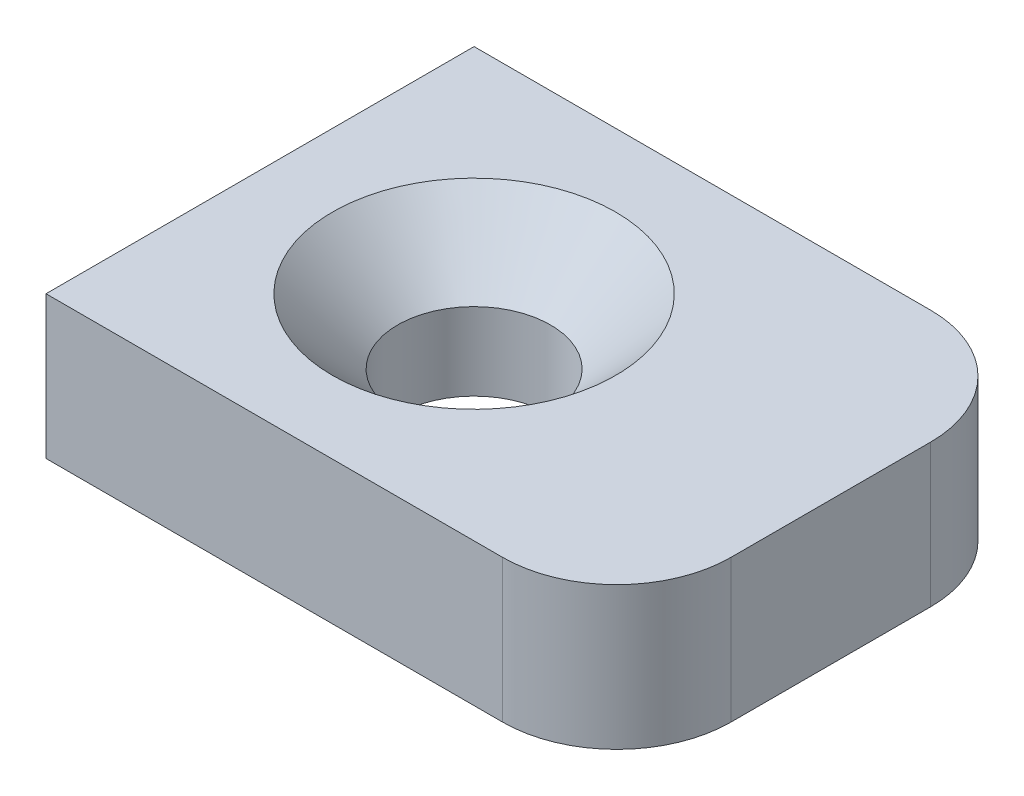
ISO-10303-21;
HEADER;
FILE_DESCRIPTION(('STEP AP214'),'2;1');
FILE_NAME('part.step','',(''),(''),'','','');
FILE_SCHEMA(('AUTOMOTIVE_DESIGN { 1 0 10303 214 1 1 1 1 }'));
ENDSEC;
DATA;
#1=APPLICATION_CONTEXT('core data for automotive mechanical design processes');
#2=APPLICATION_PROTOCOL_DEFINITION('international standard','automotive_design',2000,#1);
#3=PRODUCT_CONTEXT('',#1,'mechanical');
#4=PRODUCT('Part','Part','',(#3));
#5=PRODUCT_RELATED_PRODUCT_CATEGORY('part','',(#4));
#6=PRODUCT_DEFINITION_FORMATION('','',#4);
#7=PRODUCT_DEFINITION_CONTEXT('part definition',#1,'design');
#8=PRODUCT_DEFINITION('design','',#6,#7);
#9=PRODUCT_DEFINITION_SHAPE('','',#8);
#10=(LENGTH_UNIT() NAMED_UNIT(*) SI_UNIT(.MILLI.,.METRE.));
#11=(NAMED_UNIT(*) PLANE_ANGLE_UNIT() SI_UNIT($,.RADIAN.));
#12=(NAMED_UNIT(*) SI_UNIT($,.STERADIAN.) SOLID_ANGLE_UNIT());
#13=UNCERTAINTY_MEASURE_WITH_UNIT(LENGTH_MEASURE(1.E-05),#10,'distance_accuracy_value','');
#14=(GEOMETRIC_REPRESENTATION_CONTEXT(3) GLOBAL_UNCERTAINTY_ASSIGNED_CONTEXT((#13)) GLOBAL_UNIT_ASSIGNED_CONTEXT((#10,
#11,#12)) REPRESENTATION_CONTEXT('',''));
#15=CARTESIAN_POINT('',(0.,0.,0.));
#16=DIRECTION('',(0.,0.,1.));
#17=DIRECTION('',(1.,0.,0.));
#18=AXIS2_PLACEMENT_3D('',#15,#16,#17);
#19=CARTESIAN_POINT('',(-6.35000000000001,3.17500000000004,-4.7625));
#20=DIRECTION('',(1.,0.,0.));
#21=DIRECTION('',(0.,0.,-1.));
#22=AXIS2_PLACEMENT_3D('',#19,#20,#21);
#23=PLANE('',#22);
#24=DIRECTION('',(0.,0.,1.));
#25=VECTOR('',#24,1.);
#26=CARTESIAN_POINT('',(-6.35000000000001,0.,-4.7625));
#27=LINE('',#26,#25);
#28=CARTESIAN_POINT('',(-6.35000000000001,0.,-4.7625));
#29=VERTEX_POINT('',#28);
#30=CARTESIAN_POINT('',(-6.34999999999999,0.,4.7625));
#31=VERTEX_POINT('',#30);
#32=EDGE_CURVE('E109',#29,#31,#27,.T.);
#33=ORIENTED_EDGE('',*,*,#32,.T.);
#34=DIRECTION('',(0.,-1.,0.));
#35=VECTOR('',#34,1.);
#36=CARTESIAN_POINT('',(-6.34999999999999,3.17500000000004,4.7625));
#37=LINE('',#36,#35);
#38=CARTESIAN_POINT('',(-6.34999999999999,3.17500000000004,4.7625));
#39=VERTEX_POINT('',#38);
#40=EDGE_CURVE('E92',#39,#31,#37,.T.);
#41=ORIENTED_EDGE('',*,*,#40,.F.);
#42=DIRECTION('',(0.,0.,1.));
#43=VECTOR('',#42,1.);
#44=CARTESIAN_POINT('',(-6.35000000000001,3.17500000000004,-4.7625));
#45=LINE('',#44,#43);
#46=CARTESIAN_POINT('',(-6.35000000000001,3.17500000000004,-4.7625));
#47=VERTEX_POINT('',#46);
#48=EDGE_CURVE('E97',#47,#39,#45,.T.);
#49=ORIENTED_EDGE('',*,*,#48,.F.);
#50=DIRECTION('',(0.,-1.,0.));
#51=VECTOR('',#50,1.);
#52=CARTESIAN_POINT('',(-6.35000000000001,3.17500000000004,-4.7625));
#53=LINE('',#52,#51);
#54=EDGE_CURVE('E111',#47,#29,#53,.T.);
#55=ORIENTED_EDGE('',*,*,#54,.T.);
#56=EDGE_LOOP('',(#33,#41,#49,#55));
#57=FACE_BOUND('',#56,.T.);
#58=ADVANCED_FACE('F36',(#57),#23,.F.);
#59=CARTESIAN_POINT('',(-6.34999999999999,3.17500000000004,4.7625));
#60=DIRECTION('',(0.,0.,-1.));
#61=DIRECTION('',(-1.,0.,0.));
#62=AXIS2_PLACEMENT_3D('',#59,#60,#61);
#63=PLANE('',#62);
#64=DIRECTION('',(1.,0.,0.));
#65=VECTOR('',#64,1.);
#66=CARTESIAN_POINT('',(-6.34999999999999,0.,4.7625));
#67=LINE('',#66,#65);
#68=CARTESIAN_POINT('',(3.81,0.,4.7625));
#69=VERTEX_POINT('',#68);
#70=EDGE_CURVE('E141',#31,#69,#67,.T.);
#71=ORIENTED_EDGE('',*,*,#70,.T.);
#72=DIRECTION('',(0.,-1.,0.));
#73=VECTOR('',#72,1.);
#74=CARTESIAN_POINT('',(3.81,3.17500000000004,4.7625));
#75=LINE('',#74,#73);
#76=CARTESIAN_POINT('',(3.81,3.17500000000004,4.7625));
#77=VERTEX_POINT('',#76);
#78=EDGE_CURVE('E11',#69,#77,#75,.F.);
#79=ORIENTED_EDGE('',*,*,#78,.T.);
#80=DIRECTION('',(1.,0.,0.));
#81=VECTOR('',#80,1.);
#82=CARTESIAN_POINT('',(-6.34999999999999,3.17500000000004,4.7625));
#83=LINE('',#82,#81);
#84=EDGE_CURVE('E88',#39,#77,#83,.T.);
#85=ORIENTED_EDGE('',*,*,#84,.F.);
#86=ORIENTED_EDGE('',*,*,#40,.T.);
#87=EDGE_LOOP('',(#71,#79,#85,#86));
#88=FACE_BOUND('',#87,.T.);
#89=ADVANCED_FACE('F90',(#88),#63,.F.);
#90=CARTESIAN_POINT('',(6.35,3.17500000000004,-4.7625));
#91=DIRECTION('',(-1.,0.,0.));
#92=DIRECTION('',(0.,0.,1.));
#93=AXIS2_PLACEMENT_3D('',#90,#91,#92);
#94=PLANE('',#93);
#95=DIRECTION('',(0.,0.,-1.));
#96=VECTOR('',#95,1.);
#97=CARTESIAN_POINT('',(6.35,0.,-4.7625));
#98=LINE('',#97,#96);
#99=CARTESIAN_POINT('',(6.35,0.,2.22250000000024));
#100=VERTEX_POINT('',#99);
#101=CARTESIAN_POINT('',(6.35,0.,-2.22250000000024));
#102=VERTEX_POINT('',#101);
#103=EDGE_CURVE('E138',#100,#102,#98,.T.);
#104=ORIENTED_EDGE('',*,*,#103,.T.);
#105=DIRECTION('',(0.,-1.,0.));
#106=VECTOR('',#105,1.);
#107=CARTESIAN_POINT('',(6.35,3.17500000000004,-2.22250000000024));
#108=LINE('',#107,#106);
#109=CARTESIAN_POINT('',(6.35,3.17500000000004,-2.22250000000024));
#110=VERTEX_POINT('',#109);
#111=EDGE_CURVE('E57',#102,#110,#108,.F.);
#112=ORIENTED_EDGE('',*,*,#111,.T.);
#113=DIRECTION('',(0.,0.,-1.));
#114=VECTOR('',#113,1.);
#115=CARTESIAN_POINT('',(6.35,3.17500000000004,-4.7625));
#116=LINE('',#115,#114);
#117=CARTESIAN_POINT('',(6.35,3.17500000000004,2.22250000000024));
#118=VERTEX_POINT('',#117);
#119=EDGE_CURVE('E96',#118,#110,#116,.T.);
#120=ORIENTED_EDGE('',*,*,#119,.F.);
#121=DIRECTION('',(0.,-1.,0.));
#122=VECTOR('',#121,1.);
#123=CARTESIAN_POINT('',(6.35,3.17500000000004,2.22250000000024));
#124=LINE('',#123,#122);
#125=EDGE_CURVE('E122',#118,#100,#124,.T.);
#126=ORIENTED_EDGE('',*,*,#125,.T.);
#127=EDGE_LOOP('',(#104,#112,#120,#126));
#128=FACE_BOUND('',#127,.T.);
#129=ADVANCED_FACE('F139',(#128),#94,.F.);
#130=CARTESIAN_POINT('',(-6.35000000000001,3.17500000000004,-4.7625));
#131=DIRECTION('',(0.,0.,1.));
#132=DIRECTION('',(1.,0.,0.));
#133=AXIS2_PLACEMENT_3D('',#130,#131,#132);
#134=PLANE('',#133);
#135=DIRECTION('',(-1.,0.,0.));
#136=VECTOR('',#135,1.);
#137=CARTESIAN_POINT('',(-6.35000000000001,3.17500000000004,-4.7625));
#138=LINE('',#137,#136);
#139=CARTESIAN_POINT('',(3.81,3.17500000000004,-4.7625));
#140=VERTEX_POINT('',#139);
#141=EDGE_CURVE('E102',#140,#47,#138,.T.);
#142=ORIENTED_EDGE('',*,*,#141,.F.);
#143=DIRECTION('',(0.,-1.,0.));
#144=VECTOR('',#143,1.);
#145=CARTESIAN_POINT('',(3.81,3.17500000000004,-4.7625));
#146=LINE('',#145,#144);
#147=CARTESIAN_POINT('',(3.81,0.,-4.7625));
#148=VERTEX_POINT('',#147);
#149=EDGE_CURVE('E110',#140,#148,#146,.T.);
#150=ORIENTED_EDGE('',*,*,#149,.T.);
#151=DIRECTION('',(-1.,0.,0.));
#152=VECTOR('',#151,1.);
#153=CARTESIAN_POINT('',(-6.35000000000001,0.,-4.7625));
#154=LINE('',#153,#152);
#155=EDGE_CURVE('E106',#148,#29,#154,.T.);
#156=ORIENTED_EDGE('',*,*,#155,.T.);
#157=ORIENTED_EDGE('',*,*,#54,.F.);
#158=EDGE_LOOP('',(#142,#150,#156,#157));
#159=FACE_BOUND('',#158,.T.);
#160=ADVANCED_FACE('F131',(#159),#134,.F.);
#161=CARTESIAN_POINT('',(0.,3.17500000000004,0.));
#162=DIRECTION('',(0.,1.,0.));
#163=DIRECTION('',(0.,0.,1.));
#164=AXIS2_PLACEMENT_3D('',#161,#162,#163);
#165=PLANE('',#164);
#166=CARTESIAN_POINT('',(-1.58750000000001,3.17500000000004,0.));
#167=DIRECTION('',(0.,1.,0.));
#168=DIRECTION('',(0.,0.,1.));
#169=AXIS2_PLACEMENT_3D('',#166,#167,#168);
#170=CIRCLE('',#169,3.15);
#171=CARTESIAN_POINT('',(-1.58750000000001,3.17500000000004,3.15));
#172=VERTEX_POINT('',#171);
#173=EDGE_CURVE('E153',#172,#172,#170,.T.);
#174=ORIENTED_EDGE('',*,*,#173,.F.);
#175=EDGE_LOOP('',(#174));
#176=FACE_BOUND('',#175,.T.);
#177=ORIENTED_EDGE('',*,*,#119,.T.);
#178=CARTESIAN_POINT('',(3.81,3.17500000000004,-2.22250000000024));
#179=DIRECTION('',(0.,1.,0.));
#180=DIRECTION('',(0.,0.,1.));
#181=AXIS2_PLACEMENT_3D('',#178,#179,#180);
#182=CIRCLE('',#181,2.54);
#183=EDGE_CURVE('E44',#110,#140,#182,.T.);
#184=ORIENTED_EDGE('',*,*,#183,.T.);
#185=ORIENTED_EDGE('',*,*,#141,.T.);
#186=ORIENTED_EDGE('',*,*,#48,.T.);
#187=ORIENTED_EDGE('',*,*,#84,.T.);
#188=CARTESIAN_POINT('',(3.81,3.17500000000004,2.22250000000024));
#189=DIRECTION('',(0.,1.,0.));
#190=DIRECTION('',(0.,0.,1.));
#191=AXIS2_PLACEMENT_3D('',#188,#189,#190);
#192=CIRCLE('',#191,2.54);
#193=EDGE_CURVE('E126',#77,#118,#192,.T.);
#194=ORIENTED_EDGE('',*,*,#193,.T.);
#195=EDGE_LOOP('',(#177,#184,#185,#186,#187,#194));
#196=FACE_BOUND('',#195,.T.);
#197=ADVANCED_FACE('F100',(#176,#196),#165,.T.);
#198=CARTESIAN_POINT('',(0.,0.,0.));
#199=DIRECTION('',(0.,1.,0.));
#200=DIRECTION('',(0.,0.,1.));
#201=AXIS2_PLACEMENT_3D('',#198,#199,#200);
#202=PLANE('',#201);
#203=CARTESIAN_POINT('',(-1.58750000000001,0.,0.));
#204=DIRECTION('',(0.,1.,0.));
#205=DIRECTION('',(0.,0.,1.));
#206=AXIS2_PLACEMENT_3D('',#203,#204,#205);
#207=CIRCLE('',#206,1.7);
#208=CARTESIAN_POINT('',(-1.58750000000001,0.,1.7));
#209=VERTEX_POINT('',#208);
#210=EDGE_CURVE('E145',#209,#209,#207,.T.);
#211=ORIENTED_EDGE('',*,*,#210,.T.);
#212=EDGE_LOOP('',(#211));
#213=FACE_BOUND('',#212,.T.);
#214=ORIENTED_EDGE('',*,*,#155,.F.);
#215=CARTESIAN_POINT('',(3.81,0.,-2.22250000000024));
#216=DIRECTION('',(0.,1.,0.));
#217=DIRECTION('',(0.,0.,1.));
#218=AXIS2_PLACEMENT_3D('',#215,#216,#217);
#219=CIRCLE('',#218,2.54);
#220=EDGE_CURVE('E120',#148,#102,#219,.F.);
#221=ORIENTED_EDGE('',*,*,#220,.T.);
#222=ORIENTED_EDGE('',*,*,#103,.F.);
#223=CARTESIAN_POINT('',(3.81,0.,2.22250000000024));
#224=DIRECTION('',(0.,1.,0.));
#225=DIRECTION('',(0.,0.,1.));
#226=AXIS2_PLACEMENT_3D('',#223,#224,#225);
#227=CIRCLE('',#226,2.54);
#228=EDGE_CURVE('E114',#100,#69,#227,.F.);
#229=ORIENTED_EDGE('',*,*,#228,.T.);
#230=ORIENTED_EDGE('',*,*,#70,.F.);
#231=ORIENTED_EDGE('',*,*,#32,.F.);
#232=EDGE_LOOP('',(#214,#221,#222,#229,#230,#231));
#233=FACE_BOUND('',#232,.T.);
#234=ADVANCED_FACE('F137',(#213,#233),#202,.F.);
#235=CARTESIAN_POINT('',(-1.58750000000001,3.17500000000004,0.));
#236=DIRECTION('',(0.,1.,0.));
#237=DIRECTION('',(0.,0.,1.));
#238=AXIS2_PLACEMENT_3D('',#235,#236,#237);
#239=CYLINDRICAL_SURFACE('',#238,1.7);
#240=CARTESIAN_POINT('',(-1.58750000000001,1.72499999999998,0.));
#241=DIRECTION('',(0.,1.,0.));
#242=DIRECTION('',(0.,0.,1.));
#243=AXIS2_PLACEMENT_3D('',#240,#241,#242);
#244=CIRCLE('',#243,1.7);
#245=CARTESIAN_POINT('',(-1.58750000000001,1.72499999999998,1.7));
#246=VERTEX_POINT('',#245);
#247=EDGE_CURVE('E150',#246,#246,#244,.T.);
#248=CARTESIAN_POINT('',(-1.58750000000001,0.,1.7));
#249=CARTESIAN_POINT('',(-1.58750000000001,0.0179687499999998,1.7));
#250=CARTESIAN_POINT('',(-1.58750000000001,0.0359374999999995,1.7));
#251=CARTESIAN_POINT('',(-1.58750000000001,0.071874999999999,1.7));
#252=CARTESIAN_POINT('',(-1.58750000000001,0.0898437499999988,1.7));
#253=CARTESIAN_POINT('',(-1.58750000000001,0.125781249999998,1.7));
#254=CARTESIAN_POINT('',(-1.58750000000001,0.143749999999998,1.7));
#255=CARTESIAN_POINT('',(-1.58750000000001,0.179687499999998,1.7));
#256=CARTESIAN_POINT('',(-1.58750000000001,0.197656249999997,1.7));
#257=CARTESIAN_POINT('',(-1.58750000000001,0.233593749999997,1.7));
#258=CARTESIAN_POINT('',(-1.58750000000001,0.251562499999996,1.7));
#259=CARTESIAN_POINT('',(-1.58750000000001,0.287499999999996,1.7));
#260=CARTESIAN_POINT('',(-1.58750000000001,0.305468749999995,1.7));
#261=CARTESIAN_POINT('',(-1.58750000000001,0.341406249999995,1.7));
#262=CARTESIAN_POINT('',(-1.58750000000001,0.359374999999995,1.7));
#263=CARTESIAN_POINT('',(-1.58750000000001,0.395312499999994,1.7));
#264=CARTESIAN_POINT('',(-1.58750000000001,0.413281249999994,1.7));
#265=CARTESIAN_POINT('',(-1.58750000000001,0.449218749999993,1.7));
#266=CARTESIAN_POINT('',(-1.58750000000001,0.467187499999993,1.7));
#267=CARTESIAN_POINT('',(-1.58750000000001,0.503124999999993,1.7));
#268=CARTESIAN_POINT('',(-1.58750000000001,0.521093749999992,1.7));
#269=CARTESIAN_POINT('',(-1.58750000000001,0.557031249999992,1.7));
#270=CARTESIAN_POINT('',(-1.58750000000001,0.574999999999992,1.7));
#271=CARTESIAN_POINT('',(-1.58750000000001,0.610937499999991,1.7));
#272=CARTESIAN_POINT('',(-1.58750000000001,0.628906249999991,1.7));
#273=CARTESIAN_POINT('',(-1.58750000000001,0.664843749999991,1.7));
#274=CARTESIAN_POINT('',(-1.58750000000001,0.68281249999999,1.7));
#275=CARTESIAN_POINT('',(-1.58750000000001,0.71874999999999,1.7));
#276=CARTESIAN_POINT('',(-1.58750000000001,0.73671874999999,1.7));
#277=CARTESIAN_POINT('',(-1.58750000000001,0.772656249999989,1.7));
#278=CARTESIAN_POINT('',(-1.58750000000001,0.790624999999989,1.7));
#279=CARTESIAN_POINT('',(-1.58750000000001,0.826562499999988,1.7));
#280=CARTESIAN_POINT('',(-1.58750000000001,0.844531249999988,1.7));
#281=CARTESIAN_POINT('',(-1.58750000000001,0.880468749999988,1.7));
#282=CARTESIAN_POINT('',(-1.58750000000001,0.898437499999987,1.7));
#283=CARTESIAN_POINT('',(-1.58750000000001,0.934374999999987,1.7));
#284=CARTESIAN_POINT('',(-1.58750000000001,0.952343749999987,1.7));
#285=CARTESIAN_POINT('',(-1.58750000000001,0.988281249999986,1.7));
#286=CARTESIAN_POINT('',(-1.58750000000001,1.00624999999999,1.7));
#287=CARTESIAN_POINT('',(-1.58750000000001,1.04218749999999,1.7));
#288=CARTESIAN_POINT('',(-1.58750000000001,1.06015624999999,1.7));
#289=CARTESIAN_POINT('',(-1.58750000000001,1.09609374999998,1.7));
#290=CARTESIAN_POINT('',(-1.58750000000001,1.11406249999998,1.7));
#291=CARTESIAN_POINT('',(-1.58750000000001,1.14999999999998,1.7));
#292=CARTESIAN_POINT('',(-1.58750000000001,1.16796874999998,1.7));
#293=CARTESIAN_POINT('',(-1.58750000000001,1.20390624999998,1.7));
#294=CARTESIAN_POINT('',(-1.58750000000001,1.22187499999998,1.7));
#295=CARTESIAN_POINT('',(-1.58750000000001,1.25781249999998,1.7));
#296=CARTESIAN_POINT('',(-1.58750000000001,1.27578124999998,1.7));
#297=CARTESIAN_POINT('',(-1.58750000000001,1.31171874999998,1.7));
#298=CARTESIAN_POINT('',(-1.58750000000001,1.32968749999998,1.7));
#299=CARTESIAN_POINT('',(-1.58750000000001,1.36562499999998,1.7));
#300=CARTESIAN_POINT('',(-1.58750000000001,1.38359374999998,1.7));
#301=CARTESIAN_POINT('',(-1.58750000000001,1.41953124999998,1.7));
#302=CARTESIAN_POINT('',(-1.58750000000001,1.43749999999998,1.7));
#303=CARTESIAN_POINT('',(-1.58750000000001,1.47343749999998,1.7));
#304=CARTESIAN_POINT('',(-1.58750000000001,1.49140624999998,1.7));
#305=CARTESIAN_POINT('',(-1.58750000000001,1.52734374999998,1.7));
#306=CARTESIAN_POINT('',(-1.58750000000001,1.54531249999998,1.7));
#307=CARTESIAN_POINT('',(-1.58750000000001,1.58124999999998,1.7));
#308=CARTESIAN_POINT('',(-1.58750000000001,1.59921874999998,1.7));
#309=CARTESIAN_POINT('',(-1.58750000000001,1.63515624999998,1.7));
#310=CARTESIAN_POINT('',(-1.58750000000001,1.65312499999998,1.7));
#311=CARTESIAN_POINT('',(-1.58750000000001,1.68906249999998,1.7));
#312=CARTESIAN_POINT('',(-1.58750000000001,1.70703124999998,1.7));
#313=CARTESIAN_POINT('',(-1.58750000000001,1.72499999999998,1.7));
#314=B_SPLINE_CURVE_WITH_KNOTS('',3,(#248,#249,#250,#251,#252,#253,#254,#255,#256,#257,#258,
#259,#260,#261,#262,#263,#264,#265,#266,#267,#268,#269,#270,#271,#272,#273,#274,#275,#276,#277,
#278,#279,#280,#281,#282,#283,#284,#285,#286,#287,#288,#289,#290,#291,#292,#293,#294,#295,#296,
#297,#298,#299,#300,#301,#302,#303,#304,#305,#306,#307,#308,#309,#310,#311,#312,#313),
.UNSPECIFIED.,.F.,.F.,(4,2,2,2,2,2,2,2,2,2,2,2,2,2,2,2,2,2,2,2,2,2,2,2,2,2,2,2,2,2,2,2,4),(0.,
0.0539062499999993,0.107812499999999,0.161718749999998,0.215624999999997,0.269531249999996,
0.323437499999995,0.377343749999994,0.431249999999994,0.485156249999993,0.539062499999992,
0.592968749999991,0.646874999999991,0.70078124999999,0.754687499999989,0.808593749999989,
0.862499999999988,0.916406249999987,0.970312499999986,1.02421874999999,1.07812499999998,
1.13203124999998,1.18593749999998,1.23984374999998,1.29374999999998,1.34765624999998,
1.40156249999998,1.45546874999998,1.50937499999998,1.56328124999998,1.61718749999998,
1.67109374999998,1.72499999999998),.UNSPECIFIED.);
#315=EDGE_CURVE('BSEAM165',#209,#246,#314,.T.);
#316=ORIENTED_EDGE('',*,*,#210,.F.);
#317=ORIENTED_EDGE('',*,*,#247,.T.);
#318=ORIENTED_EDGE('',*,*,#315,.T.);
#319=ORIENTED_EDGE('',*,*,#315,.F.);
#320=EDGE_LOOP('',(#316,#318,#317,#319));
#321=FACE_BOUND('',#320,.T.);
#322=ADVANCED_FACE('F165',(#321),#239,.F.);
#323=CARTESIAN_POINT('',(-1.58750000000001,3.17500000000004,0.));
#324=DIRECTION('',(0.,1.,0.));
#325=DIRECTION('',(0.,0.,1.));
#326=AXIS2_PLACEMENT_3D('',#323,#324,#325);
#327=CONICAL_SURFACE('',#326,3.15,0.785398163397448);
#328=CARTESIAN_POINT('',(-1.58750000000001,1.72499999999998,1.69999999999994));
#329=CARTESIAN_POINT('',(-1.58750000000001,1.74010416666664,1.7151041666666));
#330=CARTESIAN_POINT('',(-1.58750000000001,1.75520833333331,1.73020833333327));
#331=CARTESIAN_POINT('',(-1.58750000000001,1.78541666666665,1.76041666666661));
#332=CARTESIAN_POINT('',(-1.58750000000001,1.80052083333331,1.77552083333327));
#333=CARTESIAN_POINT('',(-1.58750000000001,1.83072916666665,1.80572916666661));
#334=CARTESIAN_POINT('',(-1.58750000000001,1.84583333333331,1.82083333333328));
#335=CARTESIAN_POINT('',(-1.58750000000001,1.87604166666665,1.85104166666661));
#336=CARTESIAN_POINT('',(-1.58750000000001,1.89114583333332,1.86614583333328));
#337=CARTESIAN_POINT('',(-1.58750000000001,1.92135416666665,1.89635416666661));
#338=CARTESIAN_POINT('',(-1.58750000000001,1.93645833333332,1.91145833333328));
#339=CARTESIAN_POINT('',(-1.58750000000001,1.96666666666665,1.94166666666661));
#340=CARTESIAN_POINT('',(-1.58750000000001,1.98177083333332,1.95677083333328));
#341=CARTESIAN_POINT('',(-1.58750000000001,2.01197916666666,1.98697916666662));
#342=CARTESIAN_POINT('',(-1.58750000000001,2.02708333333332,2.00208333333328));
#343=CARTESIAN_POINT('',(-1.58750000000001,2.05729166666666,2.03229166666662));
#344=CARTESIAN_POINT('',(-1.58750000000001,2.07239583333332,2.04739583333329));
#345=CARTESIAN_POINT('',(-1.58750000000001,2.10260416666666,2.07760416666662));
#346=CARTESIAN_POINT('',(-1.58750000000001,2.11770833333333,2.09270833333329));
#347=CARTESIAN_POINT('',(-1.58750000000001,2.14791666666666,2.12291666666662));
#348=CARTESIAN_POINT('',(-1.58750000000001,2.16302083333333,2.13802083333329));
#349=CARTESIAN_POINT('',(-1.58750000000001,2.19322916666666,2.16822916666662));
#350=CARTESIAN_POINT('',(-1.58750000000001,2.20833333333333,2.18333333333329));
#351=CARTESIAN_POINT('',(-1.58750000000001,2.23854166666667,2.21354166666663));
#352=CARTESIAN_POINT('',(-1.58750000000001,2.25364583333333,2.22864583333329));
#353=CARTESIAN_POINT('',(-1.58750000000001,2.28385416666667,2.25885416666663));
#354=CARTESIAN_POINT('',(-1.58750000000001,2.29895833333333,2.2739583333333));
#355=CARTESIAN_POINT('',(-1.58750000000001,2.32916666666667,2.30416666666663));
#356=CARTESIAN_POINT('',(-1.58750000000001,2.34427083333334,2.3192708333333));
#357=CARTESIAN_POINT('',(-1.58750000000001,2.37447916666667,2.34947916666663));
#358=CARTESIAN_POINT('',(-1.58750000000001,2.38958333333334,2.3645833333333));
#359=CARTESIAN_POINT('',(-1.58750000000001,2.41979166666667,2.39479166666663));
#360=CARTESIAN_POINT('',(-1.58750000000001,2.43489583333334,2.4098958333333));
#361=CARTESIAN_POINT('',(-1.58750000000001,2.46510416666667,2.44010416666664));
#362=CARTESIAN_POINT('',(-1.58750000000001,2.48020833333334,2.4552083333333));
#363=CARTESIAN_POINT('',(-1.58750000000001,2.51041666666668,2.48541666666664));
#364=CARTESIAN_POINT('',(-1.58750000000001,2.52552083333334,2.50052083333331));
#365=CARTESIAN_POINT('',(-1.58750000000001,2.55572916666668,2.53072916666664));
#366=CARTESIAN_POINT('',(-1.58750000000001,2.57083333333335,2.54583333333331));
#367=CARTESIAN_POINT('',(-1.58750000000001,2.60104166666668,2.57604166666664));
#368=CARTESIAN_POINT('',(-1.58750000000001,2.61614583333335,2.59114583333331));
#369=CARTESIAN_POINT('',(-1.58750000000001,2.64635416666668,2.62135416666664));
#370=CARTESIAN_POINT('',(-1.58750000000001,2.66145833333335,2.63645833333331));
#371=CARTESIAN_POINT('',(-1.58750000000001,2.69166666666668,2.66666666666665));
#372=CARTESIAN_POINT('',(-1.58750000000001,2.70677083333335,2.68177083333331));
#373=CARTESIAN_POINT('',(-1.58750000000001,2.73697916666669,2.71197916666665));
#374=CARTESIAN_POINT('',(-1.58750000000001,2.75208333333335,2.72708333333332));
#375=CARTESIAN_POINT('',(-1.58750000000001,2.78229166666669,2.75729166666665));
#376=CARTESIAN_POINT('',(-1.58750000000001,2.79739583333336,2.77239583333332));
#377=CARTESIAN_POINT('',(-1.58750000000001,2.82760416666669,2.80260416666665));
#378=CARTESIAN_POINT('',(-1.58750000000001,2.84270833333336,2.81770833333332));
#379=CARTESIAN_POINT('',(-1.58750000000001,2.87291666666669,2.84791666666665));
#380=CARTESIAN_POINT('',(-1.58750000000001,2.88802083333336,2.86302083333332));
#381=CARTESIAN_POINT('',(-1.58750000000001,2.91822916666669,2.89322916666665));
#382=CARTESIAN_POINT('',(-1.58750000000001,2.93333333333336,2.90833333333332));
#383=CARTESIAN_POINT('',(-1.58750000000001,2.9635416666667,2.93854166666666));
#384=CARTESIAN_POINT('',(-1.58750000000001,2.97864583333336,2.95364583333332));
#385=CARTESIAN_POINT('',(-1.58750000000001,3.0088541666667,2.98385416666666));
#386=CARTESIAN_POINT('',(-1.58750000000001,3.02395833333337,2.99895833333333));
#387=CARTESIAN_POINT('',(-1.58750000000001,3.0541666666667,3.02916666666666));
#388=CARTESIAN_POINT('',(-1.58750000000001,3.06927083333337,3.04427083333333));
#389=CARTESIAN_POINT('',(-1.58750000000001,3.0994791666667,3.07447916666666));
#390=CARTESIAN_POINT('',(-1.58750000000001,3.11458333333337,3.08958333333333));
#391=CARTESIAN_POINT('',(-1.58750000000001,3.1447916666667,3.11979166666666));
#392=CARTESIAN_POINT('',(-1.58750000000001,3.15989583333337,3.13489583333333));
#393=CARTESIAN_POINT('',(-1.58750000000001,3.17500000000004,3.15));
#394=B_SPLINE_CURVE_WITH_KNOTS('',3,(#328,#329,#330,#331,#332,#333,#334,#335,#336,#337,#338,
#339,#340,#341,#342,#343,#344,#345,#346,#347,#348,#349,#350,#351,#352,#353,#354,#355,#356,#357,
#358,#359,#360,#361,#362,#363,#364,#365,#366,#367,#368,#369,#370,#371,#372,#373,#374,#375,#376,
#377,#378,#379,#380,#381,#382,#383,#384,#385,#386,#387,#388,#389,#390,#391,#392,#393),
.UNSPECIFIED.,.F.,.F.,(4,2,2,2,2,2,2,2,2,2,2,2,2,2,2,2,2,2,2,2,2,2,2,2,2,2,2,2,2,2,2,2,4),(0.,
0.0640815520450336,0.128163104090067,0.192244656135101,0.256326208180135,0.320407760225168,
0.384489312270202,0.448570864315236,0.512652416360269,0.576733968405303,0.640815520450337,
0.70489707249537,0.768978624540404,0.833060176585437,0.897141728630471,0.961223280675505,
1.02530483272054,1.08938638476557,1.15346793681061,1.21754948885564,1.28163104090067,
1.34571259294571,1.40979414499074,1.47387569703577,1.53795724908081,1.60203880112584,
1.66612035317088,1.73020190521591,1.79428345726094,1.85836500930598,1.92244656135101,
1.98652811339604,2.05060966544108),.UNSPECIFIED.);
#395=EDGE_CURVE('BSEAM157',#246,#172,#394,.T.);
#396=ORIENTED_EDGE('',*,*,#247,.F.);
#397=ORIENTED_EDGE('',*,*,#173,.T.);
#398=ORIENTED_EDGE('',*,*,#395,.T.);
#399=ORIENTED_EDGE('',*,*,#395,.F.);
#400=EDGE_LOOP('',(#396,#398,#397,#399));
#401=FACE_BOUND('',#400,.T.);
#402=ADVANCED_FACE('F157',(#401),#327,.F.);
#403=CARTESIAN_POINT('',(3.81,3.17500000000004,-2.22250000000024));
#404=DIRECTION('',(0.,-1.,0.));
#405=DIRECTION('',(0.,0.,-1.));
#406=AXIS2_PLACEMENT_3D('',#403,#404,#405);
#407=CYLINDRICAL_SURFACE('',#406,2.54);
#408=ORIENTED_EDGE('',*,*,#183,.F.);
#409=ORIENTED_EDGE('',*,*,#111,.F.);
#410=ORIENTED_EDGE('',*,*,#220,.F.);
#411=ORIENTED_EDGE('',*,*,#149,.F.);
#412=EDGE_LOOP('',(#408,#409,#410,#411));
#413=FACE_BOUND('',#412,.T.);
#414=ADVANCED_FACE('F134',(#413),#407,.T.);
#415=CARTESIAN_POINT('',(3.81,3.17500000000004,2.22250000000024));
#416=DIRECTION('',(0.,-1.,0.));
#417=DIRECTION('',(0.,0.,-1.));
#418=AXIS2_PLACEMENT_3D('',#415,#416,#417);
#419=CYLINDRICAL_SURFACE('',#418,2.54);
#420=ORIENTED_EDGE('',*,*,#193,.F.);
#421=ORIENTED_EDGE('',*,*,#78,.F.);
#422=ORIENTED_EDGE('',*,*,#228,.F.);
#423=ORIENTED_EDGE('',*,*,#125,.F.);
#424=EDGE_LOOP('',(#420,#421,#422,#423));
#425=FACE_BOUND('',#424,.T.);
#426=ADVANCED_FACE('F38',(#425),#419,.T.);
#427=CLOSED_SHELL('',(#58,#89,#129,#160,#197,#234,#322,#402,#414,#426));
#428=MANIFOLD_SOLID_BREP('B2',#427);
#429=ADVANCED_BREP_SHAPE_REPRESENTATION('',(#18,#428),#14);
#430=SHAPE_DEFINITION_REPRESENTATION(#9,#429);
ENDSEC;
END-ISO-10303-21;
